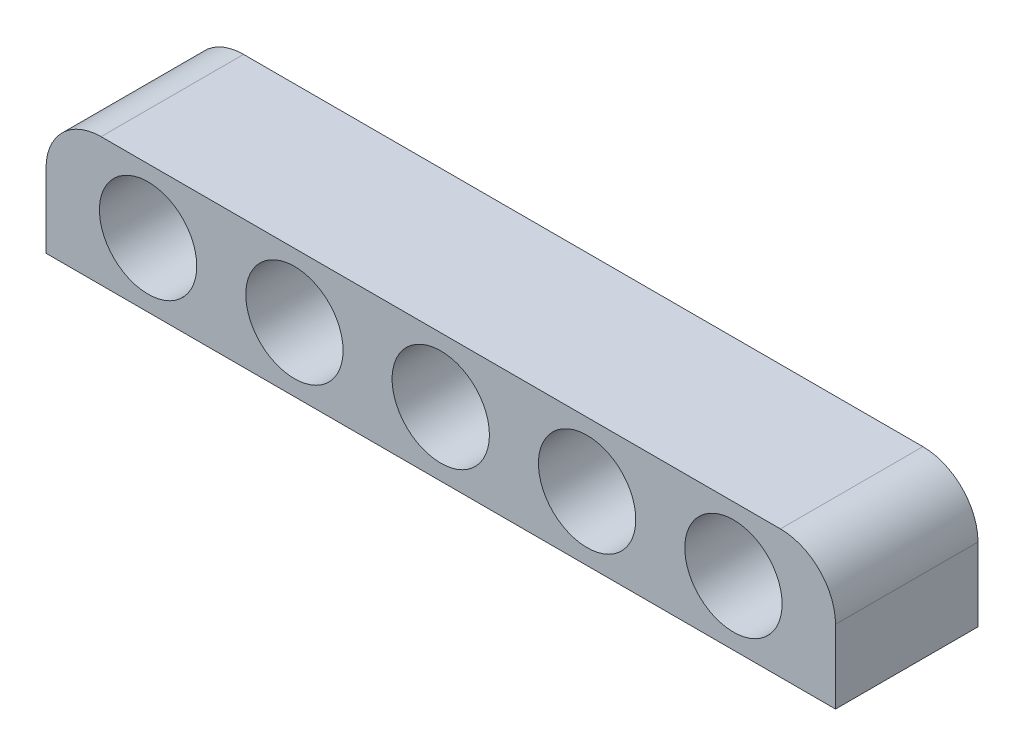
ISO-10303-21;
HEADER;
FILE_DESCRIPTION(('STEP AP214'),'2;1');
FILE_NAME('part.step','',(''),(''),'','','');
FILE_SCHEMA(('AUTOMOTIVE_DESIGN { 1 0 10303 214 1 1 1 1 }'));
ENDSEC;
DATA;
#1=APPLICATION_CONTEXT('core data for automotive mechanical design processes');
#2=APPLICATION_PROTOCOL_DEFINITION('international standard','automotive_design',2000,#1);
#3=PRODUCT_CONTEXT('',#1,'mechanical');
#4=PRODUCT('Part','Part','',(#3));
#5=PRODUCT_RELATED_PRODUCT_CATEGORY('part','',(#4));
#6=PRODUCT_DEFINITION_FORMATION('','',#4);
#7=PRODUCT_DEFINITION_CONTEXT('part definition',#1,'design');
#8=PRODUCT_DEFINITION('design','',#6,#7);
#9=PRODUCT_DEFINITION_SHAPE('','',#8);
#10=(LENGTH_UNIT() NAMED_UNIT(*) SI_UNIT(.MILLI.,.METRE.));
#11=(NAMED_UNIT(*) PLANE_ANGLE_UNIT() SI_UNIT($,.RADIAN.));
#12=(NAMED_UNIT(*) SI_UNIT($,.STERADIAN.) SOLID_ANGLE_UNIT());
#13=UNCERTAINTY_MEASURE_WITH_UNIT(LENGTH_MEASURE(1.E-05),#10,'distance_accuracy_value','');
#14=(GEOMETRIC_REPRESENTATION_CONTEXT(3) GLOBAL_UNCERTAINTY_ASSIGNED_CONTEXT((#13)) GLOBAL_UNIT_ASSIGNED_CONTEXT((#10,
#11,#12)) REPRESENTATION_CONTEXT('',''));
#15=CARTESIAN_POINT('',(0.,0.,0.));
#16=DIRECTION('',(0.,0.,1.));
#17=DIRECTION('',(1.,0.,0.));
#18=AXIS2_PLACEMENT_3D('',#15,#16,#17);
#19=CARTESIAN_POINT('',(0.,0.,7.76));
#20=DIRECTION('',(0.,0.,1.));
#21=DIRECTION('',(1.,0.,0.));
#22=AXIS2_PLACEMENT_3D('',#19,#20,#21);
#23=PLANE('',#22);
#24=CARTESIAN_POINT('',(-15.94,0.,7.76));
#25=DIRECTION('',(0.,0.,1.));
#26=DIRECTION('',(1.,0.,0.));
#27=AXIS2_PLACEMENT_3D('',#24,#25,#26);
#28=CIRCLE('',#27,2.65);
#29=CARTESIAN_POINT('',(-13.29,0.,7.76));
#30=VERTEX_POINT('',#29);
#31=EDGE_CURVE('E121',#30,#30,#28,.T.);
#32=ORIENTED_EDGE('',*,*,#31,.F.);
#33=EDGE_LOOP('',(#32));
#34=FACE_BOUND('',#33,.T.);
#35=CARTESIAN_POINT('',(15.94,0.,7.76));
#36=DIRECTION('',(0.,0.,1.));
#37=DIRECTION('',(1.,0.,0.));
#38=AXIS2_PLACEMENT_3D('',#35,#36,#37);
#39=CIRCLE('',#38,2.65);
#40=CARTESIAN_POINT('',(18.59,0.,7.76));
#41=VERTEX_POINT('',#40);
#42=EDGE_CURVE('E120',#41,#41,#39,.T.);
#43=ORIENTED_EDGE('',*,*,#42,.F.);
#44=EDGE_LOOP('',(#43));
#45=FACE_BOUND('',#44,.T.);
#46=CARTESIAN_POINT('',(-7.97,0.,7.76));
#47=DIRECTION('',(0.,0.,1.));
#48=DIRECTION('',(1.,0.,0.));
#49=AXIS2_PLACEMENT_3D('',#46,#47,#48);
#50=CIRCLE('',#49,2.65);
#51=CARTESIAN_POINT('',(-5.32,0.,7.76));
#52=VERTEX_POINT('',#51);
#53=EDGE_CURVE('E131',#52,#52,#50,.T.);
#54=ORIENTED_EDGE('',*,*,#53,.F.);
#55=EDGE_LOOP('',(#54));
#56=FACE_BOUND('',#55,.T.);
#57=CARTESIAN_POINT('',(7.97,0.,7.76));
#58=DIRECTION('',(0.,0.,1.));
#59=DIRECTION('',(1.,0.,0.));
#60=AXIS2_PLACEMENT_3D('',#57,#58,#59);
#61=CIRCLE('',#60,2.65);
#62=CARTESIAN_POINT('',(10.62,0.,7.76));
#63=VERTEX_POINT('',#62);
#64=EDGE_CURVE('E127',#63,#63,#61,.T.);
#65=ORIENTED_EDGE('',*,*,#64,.F.);
#66=EDGE_LOOP('',(#65));
#67=FACE_BOUND('',#66,.T.);
#68=CARTESIAN_POINT('',(0.,0.,7.76));
#69=DIRECTION('',(0.,0.,1.));
#70=DIRECTION('',(1.,0.,0.));
#71=AXIS2_PLACEMENT_3D('',#68,#69,#70);
#72=CIRCLE('',#71,2.65);
#73=CARTESIAN_POINT('',(2.65,0.,7.76));
#74=VERTEX_POINT('',#73);
#75=EDGE_CURVE('E130',#74,#74,#72,.T.);
#76=ORIENTED_EDGE('',*,*,#75,.F.);
#77=EDGE_LOOP('',(#76));
#78=FACE_BOUND('',#77,.T.);
#79=DIRECTION('',(0.,-1.,0.));
#80=VECTOR('',#79,1.);
#81=CARTESIAN_POINT('',(21.5,3.5,7.76));
#82=LINE('',#81,#80);
#83=CARTESIAN_POINT('',(21.5,0.5,7.76));
#84=VERTEX_POINT('',#83);
#85=CARTESIAN_POINT('',(21.5,-3.5,7.76));
#86=VERTEX_POINT('',#85);
#87=EDGE_CURVE('E112',#84,#86,#82,.T.);
#88=ORIENTED_EDGE('',*,*,#87,.F.);
#89=CARTESIAN_POINT('',(18.5,0.5,7.76));
#90=DIRECTION('',(0.,0.,1.));
#91=DIRECTION('',(1.,0.,0.));
#92=AXIS2_PLACEMENT_3D('',#89,#90,#91);
#93=CIRCLE('',#92,3.);
#94=CARTESIAN_POINT('',(18.5,3.5,7.76));
#95=VERTEX_POINT('',#94);
#96=EDGE_CURVE('E155',#84,#95,#93,.T.);
#97=ORIENTED_EDGE('',*,*,#96,.T.);
#98=DIRECTION('',(1.,0.,0.));
#99=VECTOR('',#98,1.);
#100=CARTESIAN_POINT('',(-21.,3.5,7.76));
#101=LINE('',#100,#99);
#102=CARTESIAN_POINT('',(-18.5,3.5,7.76));
#103=VERTEX_POINT('',#102);
#104=EDGE_CURVE('E115',#103,#95,#101,.T.);
#105=ORIENTED_EDGE('',*,*,#104,.F.);
#106=CARTESIAN_POINT('',(-18.5,0.5,7.76));
#107=DIRECTION('',(0.,0.,1.));
#108=DIRECTION('',(1.,0.,0.));
#109=AXIS2_PLACEMENT_3D('',#106,#107,#108);
#110=CIRCLE('',#109,3.);
#111=CARTESIAN_POINT('',(-21.5,0.5,7.76));
#112=VERTEX_POINT('',#111);
#113=EDGE_CURVE('E153',#103,#112,#110,.T.);
#114=ORIENTED_EDGE('',*,*,#113,.T.);
#115=DIRECTION('',(0.,1.,0.));
#116=VECTOR('',#115,1.);
#117=CARTESIAN_POINT('',(-21.5,3.5,7.76));
#118=LINE('',#117,#116);
#119=CARTESIAN_POINT('',(-21.5,-3.5,7.76));
#120=VERTEX_POINT('',#119);
#121=EDGE_CURVE('E102',#120,#112,#118,.T.);
#122=ORIENTED_EDGE('',*,*,#121,.F.);
#123=DIRECTION('',(-1.,0.,0.));
#124=VECTOR('',#123,1.);
#125=CARTESIAN_POINT('',(-21.,-3.5,7.76));
#126=LINE('',#125,#124);
#127=EDGE_CURVE('E106',#86,#120,#126,.T.);
#128=ORIENTED_EDGE('',*,*,#127,.F.);
#129=EDGE_LOOP('',(#88,#97,#105,#114,#122,#128));
#130=FACE_BOUND('',#129,.T.);
#131=ADVANCED_FACE('F33',(#34,#45,#56,#67,#78,#130),#23,.T.);
#132=CARTESIAN_POINT('',(0.,0.,0.));
#133=DIRECTION('',(0.,0.,1.));
#134=DIRECTION('',(1.,0.,0.));
#135=AXIS2_PLACEMENT_3D('',#132,#133,#134);
#136=PLANE('',#135);
#137=CARTESIAN_POINT('',(-15.94,0.,0.));
#138=DIRECTION('',(0.,0.,1.));
#139=DIRECTION('',(1.,0.,0.));
#140=AXIS2_PLACEMENT_3D('',#137,#138,#139);
#141=CIRCLE('',#140,2.65);
#142=CARTESIAN_POINT('',(-13.29,0.,0.));
#143=VERTEX_POINT('',#142);
#144=EDGE_CURVE('E134',#143,#143,#141,.T.);
#145=ORIENTED_EDGE('',*,*,#144,.T.);
#146=EDGE_LOOP('',(#145));
#147=FACE_BOUND('',#146,.T.);
#148=CARTESIAN_POINT('',(15.94,0.,0.));
#149=DIRECTION('',(0.,0.,1.));
#150=DIRECTION('',(1.,0.,0.));
#151=AXIS2_PLACEMENT_3D('',#148,#149,#150);
#152=CIRCLE('',#151,2.65);
#153=CARTESIAN_POINT('',(18.59,0.,0.));
#154=VERTEX_POINT('',#153);
#155=EDGE_CURVE('E124',#154,#154,#152,.T.);
#156=ORIENTED_EDGE('',*,*,#155,.T.);
#157=EDGE_LOOP('',(#156));
#158=FACE_BOUND('',#157,.T.);
#159=CARTESIAN_POINT('',(-7.97,0.,0.));
#160=DIRECTION('',(0.,0.,1.));
#161=DIRECTION('',(1.,0.,0.));
#162=AXIS2_PLACEMENT_3D('',#159,#160,#161);
#163=CIRCLE('',#162,2.65);
#164=CARTESIAN_POINT('',(-5.32,0.,0.));
#165=VERTEX_POINT('',#164);
#166=EDGE_CURVE('E143',#165,#165,#163,.T.);
#167=ORIENTED_EDGE('',*,*,#166,.T.);
#168=EDGE_LOOP('',(#167));
#169=FACE_BOUND('',#168,.T.);
#170=CARTESIAN_POINT('',(7.97,0.,0.));
#171=DIRECTION('',(0.,0.,1.));
#172=DIRECTION('',(1.,0.,0.));
#173=AXIS2_PLACEMENT_3D('',#170,#171,#172);
#174=CIRCLE('',#173,2.65);
#175=CARTESIAN_POINT('',(10.62,0.,0.));
#176=VERTEX_POINT('',#175);
#177=EDGE_CURVE('E140',#176,#176,#174,.T.);
#178=ORIENTED_EDGE('',*,*,#177,.T.);
#179=EDGE_LOOP('',(#178));
#180=FACE_BOUND('',#179,.T.);
#181=CARTESIAN_POINT('',(0.,0.,0.));
#182=DIRECTION('',(0.,0.,1.));
#183=DIRECTION('',(1.,0.,0.));
#184=AXIS2_PLACEMENT_3D('',#181,#182,#183);
#185=CIRCLE('',#184,2.65);
#186=CARTESIAN_POINT('',(2.65,0.,0.));
#187=VERTEX_POINT('',#186);
#188=EDGE_CURVE('E137',#187,#187,#185,.T.);
#189=ORIENTED_EDGE('',*,*,#188,.T.);
#190=EDGE_LOOP('',(#189));
#191=FACE_BOUND('',#190,.T.);
#192=DIRECTION('',(-1.,0.,0.));
#193=VECTOR('',#192,1.);
#194=CARTESIAN_POINT('',(-21.,3.5,0.));
#195=LINE('',#194,#193);
#196=CARTESIAN_POINT('',(18.5,3.5,0.));
#197=VERTEX_POINT('',#196);
#198=CARTESIAN_POINT('',(-18.5,3.5,0.));
#199=VERTEX_POINT('',#198);
#200=EDGE_CURVE('E118',#197,#199,#195,.T.);
#201=ORIENTED_EDGE('',*,*,#200,.F.);
#202=CARTESIAN_POINT('',(18.5,0.5,0.));
#203=DIRECTION('',(0.,0.,1.));
#204=DIRECTION('',(1.,0.,0.));
#205=AXIS2_PLACEMENT_3D('',#202,#203,#204);
#206=CIRCLE('',#205,3.);
#207=CARTESIAN_POINT('',(21.5,0.5,0.));
#208=VERTEX_POINT('',#207);
#209=EDGE_CURVE('E41',#197,#208,#206,.F.);
#210=ORIENTED_EDGE('',*,*,#209,.T.);
#211=DIRECTION('',(0.,1.,0.));
#212=VECTOR('',#211,1.);
#213=CARTESIAN_POINT('',(21.5,3.5,0.));
#214=LINE('',#213,#212);
#215=CARTESIAN_POINT('',(21.5,-3.5,0.));
#216=VERTEX_POINT('',#215);
#217=EDGE_CURVE('E97',#216,#208,#214,.T.);
#218=ORIENTED_EDGE('',*,*,#217,.F.);
#219=DIRECTION('',(1.,0.,0.));
#220=VECTOR('',#219,1.);
#221=CARTESIAN_POINT('',(-21.,-3.5,0.));
#222=LINE('',#221,#220);
#223=CARTESIAN_POINT('',(-21.5,-3.5,0.));
#224=VERTEX_POINT('',#223);
#225=EDGE_CURVE('E94',#224,#216,#222,.T.);
#226=ORIENTED_EDGE('',*,*,#225,.F.);
#227=DIRECTION('',(0.,-1.,0.));
#228=VECTOR('',#227,1.);
#229=CARTESIAN_POINT('',(-21.5,3.5,0.));
#230=LINE('',#229,#228);
#231=CARTESIAN_POINT('',(-21.5,0.5,0.));
#232=VERTEX_POINT('',#231);
#233=EDGE_CURVE('E85',#232,#224,#230,.T.);
#234=ORIENTED_EDGE('',*,*,#233,.F.);
#235=CARTESIAN_POINT('',(-18.5,0.5,0.));
#236=DIRECTION('',(0.,0.,1.));
#237=DIRECTION('',(1.,0.,0.));
#238=AXIS2_PLACEMENT_3D('',#235,#236,#237);
#239=CIRCLE('',#238,3.);
#240=EDGE_CURVE('E48',#232,#199,#239,.F.);
#241=ORIENTED_EDGE('',*,*,#240,.T.);
#242=EDGE_LOOP('',(#201,#210,#218,#226,#234,#241));
#243=FACE_BOUND('',#242,.T.);
#244=ADVANCED_FACE('F95',(#147,#158,#169,#180,#191,#243),#136,.F.);
#245=CARTESIAN_POINT('',(0.,0.,-0.239999999999997));
#246=DIRECTION('',(0.,0.,1.));
#247=DIRECTION('',(1.,0.,0.));
#248=AXIS2_PLACEMENT_3D('',#245,#246,#247);
#249=CYLINDRICAL_SURFACE('',#248,2.65);
#250=ORIENTED_EDGE('',*,*,#75,.T.);
#251=EDGE_LOOP('',(#250));
#252=FACE_BOUND('',#251,.T.);
#253=ORIENTED_EDGE('',*,*,#188,.F.);
#254=EDGE_LOOP('',(#253));
#255=FACE_BOUND('',#254,.T.);
#256=ADVANCED_FACE('F184',(#252,#255),#249,.F.);
#257=CARTESIAN_POINT('',(7.97,0.,-0.239999999999997));
#258=DIRECTION('',(0.,0.,1.));
#259=DIRECTION('',(1.,0.,0.));
#260=AXIS2_PLACEMENT_3D('',#257,#258,#259);
#261=CYLINDRICAL_SURFACE('',#260,2.65);
#262=ORIENTED_EDGE('',*,*,#64,.T.);
#263=EDGE_LOOP('',(#262));
#264=FACE_BOUND('',#263,.T.);
#265=ORIENTED_EDGE('',*,*,#177,.F.);
#266=EDGE_LOOP('',(#265));
#267=FACE_BOUND('',#266,.T.);
#268=ADVANCED_FACE('F192',(#264,#267),#261,.F.);
#269=CARTESIAN_POINT('',(-7.97,0.,-0.239999999999997));
#270=DIRECTION('',(0.,0.,1.));
#271=DIRECTION('',(1.,0.,0.));
#272=AXIS2_PLACEMENT_3D('',#269,#270,#271);
#273=CYLINDRICAL_SURFACE('',#272,2.65);
#274=ORIENTED_EDGE('',*,*,#53,.T.);
#275=EDGE_LOOP('',(#274));
#276=FACE_BOUND('',#275,.T.);
#277=ORIENTED_EDGE('',*,*,#166,.F.);
#278=EDGE_LOOP('',(#277));
#279=FACE_BOUND('',#278,.T.);
#280=ADVANCED_FACE('F194',(#276,#279),#273,.F.);
#281=CARTESIAN_POINT('',(15.94,0.,-0.240000000000001));
#282=DIRECTION('',(0.,0.,1.));
#283=DIRECTION('',(1.,0.,0.));
#284=AXIS2_PLACEMENT_3D('',#281,#282,#283);
#285=CYLINDRICAL_SURFACE('',#284,2.65);
#286=ORIENTED_EDGE('',*,*,#42,.T.);
#287=EDGE_LOOP('',(#286));
#288=FACE_BOUND('',#287,.T.);
#289=ORIENTED_EDGE('',*,*,#155,.F.);
#290=EDGE_LOOP('',(#289));
#291=FACE_BOUND('',#290,.T.);
#292=ADVANCED_FACE('F197',(#288,#291),#285,.F.);
#293=CARTESIAN_POINT('',(-15.94,0.,-0.240000000000001));
#294=DIRECTION('',(0.,0.,1.));
#295=DIRECTION('',(1.,0.,0.));
#296=AXIS2_PLACEMENT_3D('',#293,#294,#295);
#297=CYLINDRICAL_SURFACE('',#296,2.65);
#298=ORIENTED_EDGE('',*,*,#31,.T.);
#299=EDGE_LOOP('',(#298));
#300=FACE_BOUND('',#299,.T.);
#301=ORIENTED_EDGE('',*,*,#144,.F.);
#302=EDGE_LOOP('',(#301));
#303=FACE_BOUND('',#302,.T.);
#304=ADVANCED_FACE('F204',(#300,#303),#297,.F.);
#305=CARTESIAN_POINT('',(0.,3.5,0.));
#306=DIRECTION('',(0.,1.,0.));
#307=DIRECTION('',(0.,0.,1.));
#308=AXIS2_PLACEMENT_3D('',#305,#306,#307);
#309=PLANE('',#308);
#310=ORIENTED_EDGE('',*,*,#104,.T.);
#311=DIRECTION('',(0.,0.,1.));
#312=VECTOR('',#311,1.);
#313=CARTESIAN_POINT('',(18.5,3.5,0.));
#314=LINE('',#313,#312);
#315=EDGE_CURVE('E159',#95,#197,#314,.F.);
#316=ORIENTED_EDGE('',*,*,#315,.T.);
#317=ORIENTED_EDGE('',*,*,#200,.T.);
#318=DIRECTION('',(0.,0.,-1.));
#319=VECTOR('',#318,1.);
#320=CARTESIAN_POINT('',(-18.5,3.5,0.));
#321=LINE('',#320,#319);
#322=EDGE_CURVE('E157',#199,#103,#321,.F.);
#323=ORIENTED_EDGE('',*,*,#322,.T.);
#324=EDGE_LOOP('',(#310,#316,#317,#323));
#325=FACE_BOUND('',#324,.T.);
#326=ADVANCED_FACE('F173',(#325),#309,.T.);
#327=CARTESIAN_POINT('',(21.5,0.,0.));
#328=DIRECTION('',(1.,0.,0.));
#329=DIRECTION('',(0.,0.,-1.));
#330=AXIS2_PLACEMENT_3D('',#327,#328,#329);
#331=PLANE('',#330);
#332=ORIENTED_EDGE('',*,*,#217,.T.);
#333=DIRECTION('',(0.,0.,1.));
#334=VECTOR('',#333,1.);
#335=CARTESIAN_POINT('',(21.5,0.5,0.));
#336=LINE('',#335,#334);
#337=EDGE_CURVE('E146',#208,#84,#336,.T.);
#338=ORIENTED_EDGE('',*,*,#337,.T.);
#339=ORIENTED_EDGE('',*,*,#87,.T.);
#340=DIRECTION('',(0.,0.,1.));
#341=VECTOR('',#340,1.);
#342=CARTESIAN_POINT('',(21.5,-3.5,7.76));
#343=LINE('',#342,#341);
#344=EDGE_CURVE('E101',#216,#86,#343,.T.);
#345=ORIENTED_EDGE('',*,*,#344,.F.);
#346=EDGE_LOOP('',(#332,#338,#339,#345));
#347=FACE_BOUND('',#346,.T.);
#348=ADVANCED_FACE('F166',(#347),#331,.T.);
#349=CARTESIAN_POINT('',(0.,-3.5,0.));
#350=DIRECTION('',(0.,-1.,0.));
#351=DIRECTION('',(0.,0.,-1.));
#352=AXIS2_PLACEMENT_3D('',#349,#350,#351);
#353=PLANE('',#352);
#354=ORIENTED_EDGE('',*,*,#127,.T.);
#355=DIRECTION('',(0.,0.,1.));
#356=VECTOR('',#355,1.);
#357=CARTESIAN_POINT('',(-21.5,-3.5,0.));
#358=LINE('',#357,#356);
#359=EDGE_CURVE('E90',#224,#120,#358,.T.);
#360=ORIENTED_EDGE('',*,*,#359,.F.);
#361=ORIENTED_EDGE('',*,*,#225,.T.);
#362=ORIENTED_EDGE('',*,*,#344,.T.);
#363=EDGE_LOOP('',(#354,#360,#361,#362));
#364=FACE_BOUND('',#363,.T.);
#365=ADVANCED_FACE('F104',(#364),#353,.T.);
#366=CARTESIAN_POINT('',(-21.5,0.,0.));
#367=DIRECTION('',(-1.,0.,0.));
#368=DIRECTION('',(0.,0.,1.));
#369=AXIS2_PLACEMENT_3D('',#366,#367,#368);
#370=PLANE('',#369);
#371=ORIENTED_EDGE('',*,*,#121,.T.);
#372=DIRECTION('',(0.,0.,-1.));
#373=VECTOR('',#372,1.);
#374=CARTESIAN_POINT('',(-21.5,0.5,0.));
#375=LINE('',#374,#373);
#376=EDGE_CURVE('E11',#112,#232,#375,.T.);
#377=ORIENTED_EDGE('',*,*,#376,.T.);
#378=ORIENTED_EDGE('',*,*,#233,.T.);
#379=ORIENTED_EDGE('',*,*,#359,.T.);
#380=EDGE_LOOP('',(#371,#377,#378,#379));
#381=FACE_BOUND('',#380,.T.);
#382=ADVANCED_FACE('F88',(#381),#370,.T.);
#383=CARTESIAN_POINT('',(18.5,0.5,0.));
#384=DIRECTION('',(0.,0.,1.));
#385=DIRECTION('',(1.,0.,0.));
#386=AXIS2_PLACEMENT_3D('',#383,#384,#385);
#387=CYLINDRICAL_SURFACE('',#386,3.);
#388=ORIENTED_EDGE('',*,*,#209,.F.);
#389=ORIENTED_EDGE('',*,*,#315,.F.);
#390=ORIENTED_EDGE('',*,*,#96,.F.);
#391=ORIENTED_EDGE('',*,*,#337,.F.);
#392=EDGE_LOOP('',(#388,#389,#390,#391));
#393=FACE_BOUND('',#392,.T.);
#394=ADVANCED_FACE('F168',(#393),#387,.T.);
#395=CARTESIAN_POINT('',(-18.5,0.5,0.));
#396=DIRECTION('',(0.,0.,-1.));
#397=DIRECTION('',(-1.,0.,0.));
#398=AXIS2_PLACEMENT_3D('',#395,#396,#397);
#399=CYLINDRICAL_SURFACE('',#398,3.);
#400=ORIENTED_EDGE('',*,*,#113,.F.);
#401=ORIENTED_EDGE('',*,*,#322,.F.);
#402=ORIENTED_EDGE('',*,*,#240,.F.);
#403=ORIENTED_EDGE('',*,*,#376,.F.);
#404=EDGE_LOOP('',(#400,#401,#402,#403));
#405=FACE_BOUND('',#404,.T.);
#406=ADVANCED_FACE('F35',(#405),#399,.T.);
#407=CLOSED_SHELL('',(#131,#244,#256,#268,#280,#292,#304,#326,#348,#365,#382,#394,#406));
#408=MANIFOLD_SOLID_BREP('B2',#407);
#409=ADVANCED_BREP_SHAPE_REPRESENTATION('',(#18,#408),#14);
#410=SHAPE_DEFINITION_REPRESENTATION(#9,#409);
ENDSEC;
END-ISO-10303-21;
